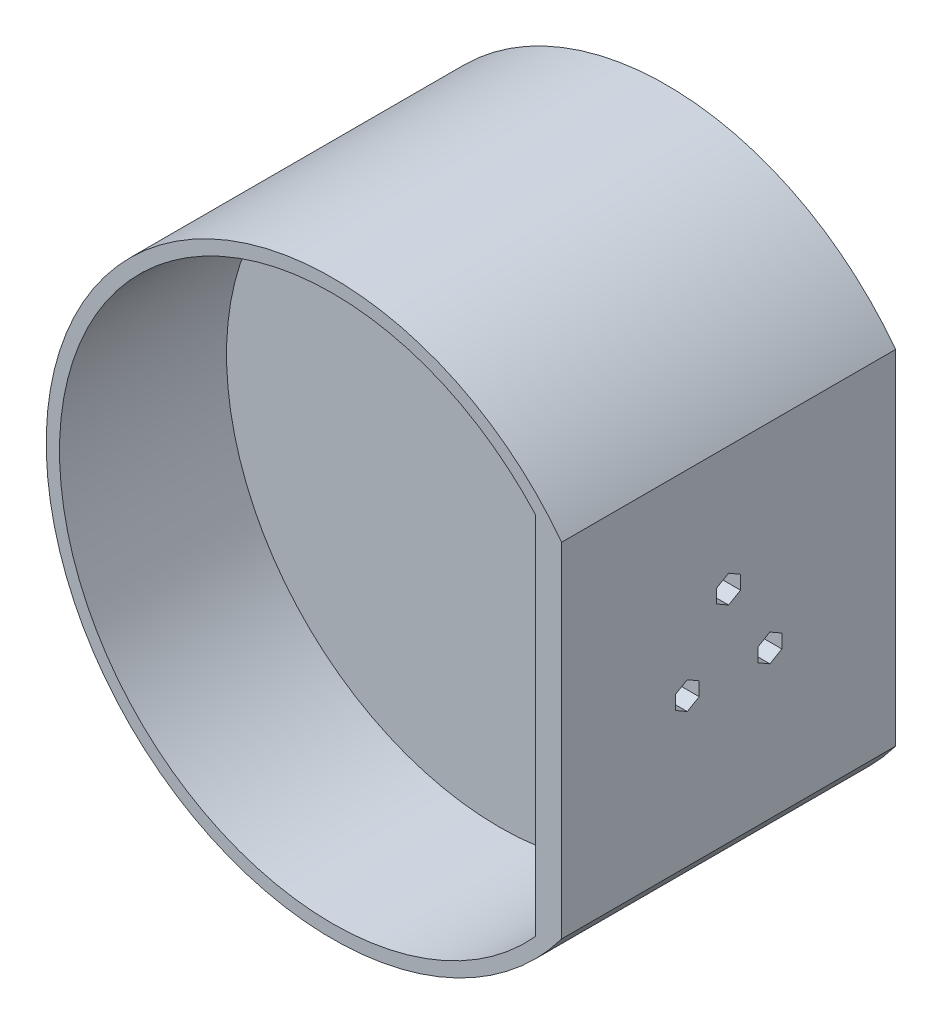
ISO-10303-21;
HEADER;
FILE_DESCRIPTION(('STEP AP214'),'2;1');
FILE_NAME('part.step','',(''),(''),'','','');
FILE_SCHEMA(('AUTOMOTIVE_DESIGN { 1 0 10303 214 1 1 1 1 }'));
ENDSEC;
DATA;
#1=APPLICATION_CONTEXT('core data for automotive mechanical design processes');
#2=APPLICATION_PROTOCOL_DEFINITION('international standard','automotive_design',2000,#1);
#3=PRODUCT_CONTEXT('',#1,'mechanical');
#4=PRODUCT('Part','Part','',(#3));
#5=PRODUCT_RELATED_PRODUCT_CATEGORY('part','',(#4));
#6=PRODUCT_DEFINITION_FORMATION('','',#4);
#7=PRODUCT_DEFINITION_CONTEXT('part definition',#1,'design');
#8=PRODUCT_DEFINITION('design','',#6,#7);
#9=PRODUCT_DEFINITION_SHAPE('','',#8);
#10=(LENGTH_UNIT() NAMED_UNIT(*) SI_UNIT(.MILLI.,.METRE.));
#11=(NAMED_UNIT(*) PLANE_ANGLE_UNIT() SI_UNIT($,.RADIAN.));
#12=(NAMED_UNIT(*) SI_UNIT($,.STERADIAN.) SOLID_ANGLE_UNIT());
#13=UNCERTAINTY_MEASURE_WITH_UNIT(LENGTH_MEASURE(1.E-05),#10,'distance_accuracy_value','');
#14=(GEOMETRIC_REPRESENTATION_CONTEXT(3) GLOBAL_UNCERTAINTY_ASSIGNED_CONTEXT((#13)) GLOBAL_UNIT_ASSIGNED_CONTEXT((#10,
#11,#12)) REPRESENTATION_CONTEXT('',''));
#15=CARTESIAN_POINT('',(0.,0.,0.));
#16=DIRECTION('',(0.,0.,1.));
#17=DIRECTION('',(1.,0.,0.));
#18=AXIS2_PLACEMENT_3D('',#15,#16,#17);
#19=CARTESIAN_POINT('',(0.,0.,70.));
#20=DIRECTION('',(0.,0.,-1.));
#21=DIRECTION('',(-1.,0.,0.));
#22=AXIS2_PLACEMENT_3D('',#19,#20,#21);
#23=CYLINDRICAL_SURFACE('',#22,60.);
#24=CARTESIAN_POINT('',(0.,0.,0.));
#25=DIRECTION('',(0.,0.,1.));
#26=DIRECTION('',(1.,0.,0.));
#27=AXIS2_PLACEMENT_3D('',#24,#25,#26);
#28=CIRCLE('',#27,60.);
#29=CARTESIAN_POINT('',(48.,36.,0.));
#30=VERTEX_POINT('',#29);
#31=CARTESIAN_POINT('',(48.,-36.,0.));
#32=VERTEX_POINT('',#31);
#33=EDGE_CURVE('E248',#30,#32,#28,.T.);
#34=ORIENTED_EDGE('',*,*,#33,.T.);
#35=DIRECTION('',(0.,0.,-1.));
#36=VECTOR('',#35,1.);
#37=CARTESIAN_POINT('',(48.,-36.,70.));
#38=LINE('',#37,#36);
#39=CARTESIAN_POINT('',(48.,-36.,70.));
#40=VERTEX_POINT('',#39);
#41=EDGE_CURVE('E11',#40,#32,#38,.T.);
#42=ORIENTED_EDGE('',*,*,#41,.F.);
#43=CARTESIAN_POINT('',(0.,0.,70.));
#44=DIRECTION('',(0.,0.,1.));
#45=DIRECTION('',(1.,0.,0.));
#46=AXIS2_PLACEMENT_3D('',#43,#44,#45);
#47=CIRCLE('',#46,60.);
#48=CARTESIAN_POINT('',(48.,36.,70.));
#49=VERTEX_POINT('',#48);
#50=EDGE_CURVE('E352',#49,#40,#47,.T.);
#51=ORIENTED_EDGE('',*,*,#50,.F.);
#52=DIRECTION('',(0.,0.,-1.));
#53=VECTOR('',#52,1.);
#54=CARTESIAN_POINT('',(48.,36.,70.));
#55=LINE('',#54,#53);
#56=EDGE_CURVE('E48',#49,#30,#55,.T.);
#57=ORIENTED_EDGE('',*,*,#56,.T.);
#58=EDGE_LOOP('',(#34,#42,#51,#57));
#59=FACE_BOUND('',#58,.T.);
#60=ADVANCED_FACE('F41',(#59),#23,.T.);
#61=CARTESIAN_POINT('',(48.,36.,70.));
#62=DIRECTION('',(-1.,0.,0.));
#63=DIRECTION('',(0.,0.,1.));
#64=AXIS2_PLACEMENT_3D('',#61,#62,#63);
#65=PLANE('',#64);
#66=DIRECTION('',(0.,0.5,-0.866025403784438));
#67=VECTOR('',#66,1.);
#68=CARTESIAN_POINT('',(48.,7.11324865405187,35.));
#69=LINE('',#68,#67);
#70=CARTESIAN_POINT('',(48.,7.11324865405188,35.));
#71=VERTEX_POINT('',#70);
#72=CARTESIAN_POINT('',(48.,8.55662432702594,32.5));
#73=VERTEX_POINT('',#72);
#74=EDGE_CURVE('E231',#71,#73,#69,.T.);
#75=ORIENTED_EDGE('',*,*,#74,.F.);
#76=DIRECTION('',(0.,-0.5,-0.866025403784439));
#77=VECTOR('',#76,1.);
#78=CARTESIAN_POINT('',(48.,8.55662432702594,37.5));
#79=LINE('',#78,#77);
#80=CARTESIAN_POINT('',(48.,8.55662432702594,37.5));
#81=VERTEX_POINT('',#80);
#82=EDGE_CURVE('E63',#81,#71,#79,.T.);
#83=ORIENTED_EDGE('',*,*,#82,.F.);
#84=DIRECTION('',(0.,-1.,0.));
#85=VECTOR('',#84,1.);
#86=CARTESIAN_POINT('',(48.,11.4433756729741,37.5));
#87=LINE('',#86,#85);
#88=CARTESIAN_POINT('',(48.,11.4433756729741,37.5));
#89=VERTEX_POINT('',#88);
#90=EDGE_CURVE('E214',#89,#81,#87,.T.);
#91=ORIENTED_EDGE('',*,*,#90,.F.);
#92=DIRECTION('',(0.,-0.500000000000001,0.866025403784438));
#93=VECTOR('',#92,1.);
#94=CARTESIAN_POINT('',(48.,12.8867513459481,35.));
#95=LINE('',#94,#93);
#96=CARTESIAN_POINT('',(48.,12.8867513459481,35.));
#97=VERTEX_POINT('',#96);
#98=EDGE_CURVE('E241',#97,#89,#95,.T.);
#99=ORIENTED_EDGE('',*,*,#98,.F.);
#100=DIRECTION('',(0.,0.499999999999999,0.866025403784439));
#101=VECTOR('',#100,1.);
#102=CARTESIAN_POINT('',(48.,11.4433756729741,32.5));
#103=LINE('',#102,#101);
#104=CARTESIAN_POINT('',(48.,11.4433756729741,32.5));
#105=VERTEX_POINT('',#104);
#106=EDGE_CURVE('E238',#105,#97,#103,.T.);
#107=ORIENTED_EDGE('',*,*,#106,.F.);
#108=DIRECTION('',(0.,1.,0.));
#109=VECTOR('',#108,1.);
#110=CARTESIAN_POINT('',(48.,8.55662432702594,32.5));
#111=LINE('',#110,#109);
#112=EDGE_CURVE('E235',#73,#105,#111,.T.);
#113=ORIENTED_EDGE('',*,*,#112,.F.);
#114=EDGE_LOOP('',(#75,#83,#91,#99,#107,#113));
#115=FACE_BOUND('',#114,.T.);
#116=DIRECTION('',(0.,-1.,0.));
#117=VECTOR('',#116,1.);
#118=CARTESIAN_POINT('',(48.,-3.5566243270258,28.8397459621553));
#119=LINE('',#118,#117);
#120=CARTESIAN_POINT('',(48.,-3.5566243270258,28.8397459621553));
#121=VERTEX_POINT('',#120);
#122=CARTESIAN_POINT('',(48.,-6.44337567297393,28.8397459621553));
#123=VERTEX_POINT('',#122);
#124=EDGE_CURVE('E286',#121,#123,#119,.T.);
#125=ORIENTED_EDGE('',*,*,#124,.F.);
#126=DIRECTION('',(0.,-0.499999999999996,0.866025403784441));
#127=VECTOR('',#126,1.);
#128=CARTESIAN_POINT('',(48.,-2.11324865405174,26.3397459621553));
#129=LINE('',#128,#127);
#130=CARTESIAN_POINT('',(48.,-2.11324865405174,26.3397459621553));
#131=VERTEX_POINT('',#130);
#132=EDGE_CURVE('E232',#131,#121,#129,.T.);
#133=ORIENTED_EDGE('',*,*,#132,.F.);
#134=DIRECTION('',(0.,0.500000000000004,0.866025403784436));
#135=VECTOR('',#134,1.);
#136=CARTESIAN_POINT('',(48.,-3.55662432702582,23.8397459621553));
#137=LINE('',#136,#135);
#138=CARTESIAN_POINT('',(48.,-3.55662432702582,23.8397459621553));
#139=VERTEX_POINT('',#138);
#140=EDGE_CURVE('E273',#139,#131,#137,.T.);
#141=ORIENTED_EDGE('',*,*,#140,.F.);
#142=DIRECTION('',(0.,1.,0.));
#143=VECTOR('',#142,1.);
#144=CARTESIAN_POINT('',(48.,-6.44337567297394,23.8397459621554));
#145=LINE('',#144,#143);
#146=CARTESIAN_POINT('',(48.,-6.44337567297394,23.8397459621554));
#147=VERTEX_POINT('',#146);
#148=EDGE_CURVE('E276',#147,#139,#145,.T.);
#149=ORIENTED_EDGE('',*,*,#148,.F.);
#150=DIRECTION('',(0.,0.499999999999996,-0.866025403784441));
#151=VECTOR('',#150,1.);
#152=CARTESIAN_POINT('',(48.,-7.886751345948,26.3397459621554));
#153=LINE('',#152,#151);
#154=CARTESIAN_POINT('',(48.,-7.886751345948,26.3397459621554));
#155=VERTEX_POINT('',#154);
#156=EDGE_CURVE('E280',#155,#147,#153,.T.);
#157=ORIENTED_EDGE('',*,*,#156,.F.);
#158=DIRECTION('',(0.,-0.500000000000004,-0.866025403784436));
#159=VECTOR('',#158,1.);
#160=CARTESIAN_POINT('',(48.,-6.44337567297393,28.8397459621553));
#161=LINE('',#160,#159);
#162=EDGE_CURVE('E283',#123,#155,#161,.T.);
#163=ORIENTED_EDGE('',*,*,#162,.F.);
#164=EDGE_LOOP('',(#125,#133,#141,#149,#157,#163));
#165=FACE_BOUND('',#164,.T.);
#166=DIRECTION('',(0.,0.500000000000008,0.866025403784434));
#167=VECTOR('',#166,1.);
#168=CARTESIAN_POINT('',(48.,-3.55662432702605,41.1602540378441));
#169=LINE('',#168,#167);
#170=CARTESIAN_POINT('',(48.,-3.55662432702605,41.1602540378441));
#171=VERTEX_POINT('',#170);
#172=CARTESIAN_POINT('',(48.,-2.11324865405196,43.6602540378441));
#173=VERTEX_POINT('',#172);
#174=EDGE_CURVE('E332',#171,#173,#169,.T.);
#175=ORIENTED_EDGE('',*,*,#174,.F.);
#176=DIRECTION('',(0.,1.,0.));
#177=VECTOR('',#176,1.);
#178=CARTESIAN_POINT('',(48.,-6.44337567297417,41.1602540378442));
#179=LINE('',#178,#177);
#180=CARTESIAN_POINT('',(48.,-6.44337567297417,41.1602540378442));
#181=VERTEX_POINT('',#180);
#182=EDGE_CURVE('E272',#181,#171,#179,.T.);
#183=ORIENTED_EDGE('',*,*,#182,.F.);
#184=DIRECTION('',(0.,0.499999999999993,-0.866025403784443));
#185=VECTOR('',#184,1.);
#186=CARTESIAN_POINT('',(48.,-7.88675134594821,43.6602540378442));
#187=LINE('',#186,#185);
#188=CARTESIAN_POINT('',(48.,-7.88675134594821,43.6602540378442));
#189=VERTEX_POINT('',#188);
#190=EDGE_CURVE('E319',#189,#181,#187,.T.);
#191=ORIENTED_EDGE('',*,*,#190,.F.);
#192=DIRECTION('',(0.,-0.500000000000008,-0.866025403784434));
#193=VECTOR('',#192,1.);
#194=CARTESIAN_POINT('',(48.,-6.44337567297413,46.1602540378442));
#195=LINE('',#194,#193);
#196=CARTESIAN_POINT('',(48.,-6.44337567297413,46.1602540378442));
#197=VERTEX_POINT('',#196);
#198=EDGE_CURVE('E322',#197,#189,#195,.T.);
#199=ORIENTED_EDGE('',*,*,#198,.F.);
#200=DIRECTION('',(0.,-1.,0.));
#201=VECTOR('',#200,1.);
#202=CARTESIAN_POINT('',(48.,-3.556624327026,46.1602540378441));
#203=LINE('',#202,#201);
#204=CARTESIAN_POINT('',(48.,-3.556624327026,46.1602540378441));
#205=VERTEX_POINT('',#204);
#206=EDGE_CURVE('E326',#205,#197,#203,.T.);
#207=ORIENTED_EDGE('',*,*,#206,.F.);
#208=DIRECTION('',(0.,-0.499999999999992,0.866025403784443));
#209=VECTOR('',#208,1.);
#210=CARTESIAN_POINT('',(48.,-2.11324865405196,43.6602540378441));
#211=LINE('',#210,#209);
#212=EDGE_CURVE('E329',#173,#205,#211,.T.);
#213=ORIENTED_EDGE('',*,*,#212,.F.);
#214=EDGE_LOOP('',(#175,#183,#191,#199,#207,#213));
#215=FACE_BOUND('',#214,.T.);
#216=DIRECTION('',(0.,1.,0.));
#217=VECTOR('',#216,1.);
#218=CARTESIAN_POINT('',(48.,36.,0.));
#219=LINE('',#218,#217);
#220=EDGE_CURVE('E356',#32,#30,#219,.T.);
#221=ORIENTED_EDGE('',*,*,#220,.T.);
#222=ORIENTED_EDGE('',*,*,#56,.F.);
#223=DIRECTION('',(0.,1.,0.));
#224=VECTOR('',#223,1.);
#225=CARTESIAN_POINT('',(48.,36.,70.));
#226=LINE('',#225,#224);
#227=EDGE_CURVE('E355',#40,#49,#226,.T.);
#228=ORIENTED_EDGE('',*,*,#227,.F.);
#229=ORIENTED_EDGE('',*,*,#41,.T.);
#230=EDGE_LOOP('',(#221,#222,#228,#229));
#231=FACE_BOUND('',#230,.T.);
#232=ADVANCED_FACE('F369',(#115,#165,#215,#231),#65,.F.);
#233=CARTESIAN_POINT('',(0.,0.,70.));
#234=DIRECTION('',(0.,0.,1.));
#235=DIRECTION('',(1.,0.,0.));
#236=AXIS2_PLACEMENT_3D('',#233,#234,#235);
#237=PLANE('',#236);
#238=CARTESIAN_POINT('',(0.,0.,70.));
#239=DIRECTION('',(0.,0.,1.));
#240=DIRECTION('',(1.,0.,0.));
#241=AXIS2_PLACEMENT_3D('',#238,#239,#240);
#242=CIRCLE('',#241,57.2145243919241);
#243=CARTESIAN_POINT('',(42.4984665001289,38.3064243506425,70.));
#244=VERTEX_POINT('',#243);
#245=CARTESIAN_POINT('',(42.4984665001289,-38.3064243506425,70.));
#246=VERTEX_POINT('',#245);
#247=EDGE_CURVE('E55',#244,#246,#242,.T.);
#248=ORIENTED_EDGE('',*,*,#247,.F.);
#249=DIRECTION('',(0.,1.,0.));
#250=VECTOR('',#249,1.);
#251=CARTESIAN_POINT('',(42.4984665001289,38.3064243506425,70.));
#252=LINE('',#251,#250);
#253=EDGE_CURVE('E201',#246,#244,#252,.T.);
#254=ORIENTED_EDGE('',*,*,#253,.F.);
#255=EDGE_LOOP('',(#248,#254));
#256=FACE_BOUND('',#255,.T.);
#257=ORIENTED_EDGE('',*,*,#50,.T.);
#258=ORIENTED_EDGE('',*,*,#227,.T.);
#259=EDGE_LOOP('',(#257,#258));
#260=FACE_BOUND('',#259,.T.);
#261=ADVANCED_FACE('F371',(#256,#260),#237,.T.);
#262=CARTESIAN_POINT('',(0.,0.,0.));
#263=DIRECTION('',(0.,0.,1.));
#264=DIRECTION('',(1.,0.,0.));
#265=AXIS2_PLACEMENT_3D('',#262,#263,#264);
#266=PLANE('',#265);
#267=ORIENTED_EDGE('',*,*,#33,.F.);
#268=ORIENTED_EDGE('',*,*,#220,.F.);
#269=EDGE_LOOP('',(#267,#268));
#270=FACE_BOUND('',#269,.T.);
#271=ADVANCED_FACE('F368',(#270),#266,.F.);
#272=CARTESIAN_POINT('',(43.,-6.44337567297417,41.1602540378442));
#273=DIRECTION('',(0.,0.,-1.));
#274=DIRECTION('',(0.,1.,0.));
#275=AXIS2_PLACEMENT_3D('',#272,#273,#274);
#276=PLANE('',#275);
#277=ORIENTED_EDGE('',*,*,#182,.T.);
#278=DIRECTION('',(1.,0.,0.));
#279=VECTOR('',#278,1.);
#280=CARTESIAN_POINT('',(43.,-3.55662432702605,41.1602540378441));
#281=LINE('',#280,#279);
#282=CARTESIAN_POINT('',(43.,-3.55662432702605,41.1602540378441));
#283=VERTEX_POINT('',#282);
#284=EDGE_CURVE('E306',#283,#171,#281,.T.);
#285=ORIENTED_EDGE('',*,*,#284,.F.);
#286=DIRECTION('',(0.,1.,0.));
#287=VECTOR('',#286,1.);
#288=CARTESIAN_POINT('',(43.,-6.44337567297417,41.1602540378442));
#289=LINE('',#288,#287);
#290=CARTESIAN_POINT('',(43.,-6.44337567297417,41.1602540378442));
#291=VERTEX_POINT('',#290);
#292=EDGE_CURVE('E323',#291,#283,#289,.T.);
#293=ORIENTED_EDGE('',*,*,#292,.F.);
#294=DIRECTION('',(1.,0.,0.));
#295=VECTOR('',#294,1.);
#296=CARTESIAN_POINT('',(43.,-6.44337567297417,41.1602540378442));
#297=LINE('',#296,#295);
#298=EDGE_CURVE('E208',#291,#181,#297,.T.);
#299=ORIENTED_EDGE('',*,*,#298,.T.);
#300=EDGE_LOOP('',(#277,#285,#293,#299));
#301=FACE_BOUND('',#300,.T.);
#302=ADVANCED_FACE('F380',(#301),#276,.F.);
#303=CARTESIAN_POINT('',(43.,-7.88675134594821,43.6602540378442));
#304=DIRECTION('',(0.,-0.866025403784443,-0.499999999999993));
#305=DIRECTION('',(0.,0.499999999999993,-0.866025403784443));
#306=AXIS2_PLACEMENT_3D('',#303,#304,#305);
#307=PLANE('',#306);
#308=ORIENTED_EDGE('',*,*,#190,.T.);
#309=ORIENTED_EDGE('',*,*,#298,.F.);
#310=DIRECTION('',(0.,0.499999999999993,-0.866025403784443));
#311=VECTOR('',#310,1.);
#312=CARTESIAN_POINT('',(43.,-7.88675134594821,43.6602540378442));
#313=LINE('',#312,#311);
#314=CARTESIAN_POINT('',(43.,-7.88675134594821,43.6602540378442));
#315=VERTEX_POINT('',#314);
#316=EDGE_CURVE('E309',#315,#291,#313,.T.);
#317=ORIENTED_EDGE('',*,*,#316,.F.);
#318=DIRECTION('',(1.,0.,0.));
#319=VECTOR('',#318,1.);
#320=CARTESIAN_POINT('',(43.,-7.88675134594821,43.6602540378442));
#321=LINE('',#320,#319);
#322=EDGE_CURVE('E316',#315,#189,#321,.T.);
#323=ORIENTED_EDGE('',*,*,#322,.T.);
#324=EDGE_LOOP('',(#308,#309,#317,#323));
#325=FACE_BOUND('',#324,.T.);
#326=ADVANCED_FACE('F405',(#325),#307,.F.);
#327=CARTESIAN_POINT('',(43.,-6.44337567297413,46.1602540378442));
#328=DIRECTION('',(0.,-0.866025403784434,0.500000000000008));
#329=DIRECTION('',(0.,-0.500000000000008,-0.866025403784434));
#330=AXIS2_PLACEMENT_3D('',#327,#328,#329);
#331=PLANE('',#330);
#332=ORIENTED_EDGE('',*,*,#198,.T.);
#333=ORIENTED_EDGE('',*,*,#322,.F.);
#334=DIRECTION('',(0.,-0.500000000000008,-0.866025403784434));
#335=VECTOR('',#334,1.);
#336=CARTESIAN_POINT('',(43.,-6.44337567297413,46.1602540378442));
#337=LINE('',#336,#335);
#338=CARTESIAN_POINT('',(43.,-6.44337567297413,46.1602540378442));
#339=VERTEX_POINT('',#338);
#340=EDGE_CURVE('E338',#339,#315,#337,.T.);
#341=ORIENTED_EDGE('',*,*,#340,.F.);
#342=DIRECTION('',(1.,0.,0.));
#343=VECTOR('',#342,1.);
#344=CARTESIAN_POINT('',(43.,-6.44337567297413,46.1602540378442));
#345=LINE('',#344,#343);
#346=EDGE_CURVE('E314',#339,#197,#345,.T.);
#347=ORIENTED_EDGE('',*,*,#346,.T.);
#348=EDGE_LOOP('',(#332,#333,#341,#347));
#349=FACE_BOUND('',#348,.T.);
#350=ADVANCED_FACE('F414',(#349),#331,.F.);
#351=CARTESIAN_POINT('',(43.,-3.556624327026,46.1602540378441));
#352=DIRECTION('',(0.,0.,1.));
#353=DIRECTION('',(0.,-1.,0.));
#354=AXIS2_PLACEMENT_3D('',#351,#352,#353);
#355=PLANE('',#354);
#356=ORIENTED_EDGE('',*,*,#206,.T.);
#357=ORIENTED_EDGE('',*,*,#346,.F.);
#358=DIRECTION('',(0.,-1.,0.));
#359=VECTOR('',#358,1.);
#360=CARTESIAN_POINT('',(43.,-3.556624327026,46.1602540378441));
#361=LINE('',#360,#359);
#362=CARTESIAN_POINT('',(43.,-3.556624327026,46.1602540378441));
#363=VERTEX_POINT('',#362);
#364=EDGE_CURVE('E341',#363,#339,#361,.T.);
#365=ORIENTED_EDGE('',*,*,#364,.F.);
#366=DIRECTION('',(1.,0.,0.));
#367=VECTOR('',#366,1.);
#368=CARTESIAN_POINT('',(43.,-3.556624327026,46.1602540378441));
#369=LINE('',#368,#367);
#370=EDGE_CURVE('E312',#363,#205,#369,.T.);
#371=ORIENTED_EDGE('',*,*,#370,.T.);
#372=EDGE_LOOP('',(#356,#357,#365,#371));
#373=FACE_BOUND('',#372,.T.);
#374=ADVANCED_FACE('F423',(#373),#355,.F.);
#375=CARTESIAN_POINT('',(43.,-2.11324865405196,43.6602540378441));
#376=DIRECTION('',(0.,0.866025403784443,0.499999999999992));
#377=DIRECTION('',(0.,-0.499999999999992,0.866025403784443));
#378=AXIS2_PLACEMENT_3D('',#375,#376,#377);
#379=PLANE('',#378);
#380=ORIENTED_EDGE('',*,*,#212,.T.);
#381=ORIENTED_EDGE('',*,*,#370,.F.);
#382=DIRECTION('',(0.,-0.499999999999992,0.866025403784443));
#383=VECTOR('',#382,1.);
#384=CARTESIAN_POINT('',(43.,-2.11324865405196,43.6602540378441));
#385=LINE('',#384,#383);
#386=CARTESIAN_POINT('',(43.,-2.11324865405196,43.6602540378441));
#387=VERTEX_POINT('',#386);
#388=EDGE_CURVE('E344',#387,#363,#385,.T.);
#389=ORIENTED_EDGE('',*,*,#388,.F.);
#390=DIRECTION('',(1.,0.,0.));
#391=VECTOR('',#390,1.);
#392=CARTESIAN_POINT('',(43.,-2.11324865405196,43.6602540378441));
#393=LINE('',#392,#391);
#394=EDGE_CURVE('E310',#387,#173,#393,.T.);
#395=ORIENTED_EDGE('',*,*,#394,.T.);
#396=EDGE_LOOP('',(#380,#381,#389,#395));
#397=FACE_BOUND('',#396,.T.);
#398=ADVANCED_FACE('F432',(#397),#379,.F.);
#399=CARTESIAN_POINT('',(43.,-3.55662432702605,41.1602540378441));
#400=DIRECTION('',(0.,0.866025403784434,-0.500000000000008));
#401=DIRECTION('',(0.,0.500000000000008,0.866025403784434));
#402=AXIS2_PLACEMENT_3D('',#399,#400,#401);
#403=PLANE('',#402);
#404=ORIENTED_EDGE('',*,*,#174,.T.);
#405=ORIENTED_EDGE('',*,*,#394,.F.);
#406=DIRECTION('',(0.,0.500000000000008,0.866025403784434));
#407=VECTOR('',#406,1.);
#408=CARTESIAN_POINT('',(43.,-3.55662432702605,41.1602540378441));
#409=LINE('',#408,#407);
#410=EDGE_CURVE('E347',#283,#387,#409,.T.);
#411=ORIENTED_EDGE('',*,*,#410,.F.);
#412=ORIENTED_EDGE('',*,*,#284,.T.);
#413=EDGE_LOOP('',(#404,#405,#411,#412));
#414=FACE_BOUND('',#413,.T.);
#415=ADVANCED_FACE('F441',(#414),#403,.F.);
#416=CARTESIAN_POINT('',(43.,0.,0.));
#417=DIRECTION('',(1.,0.,0.));
#418=DIRECTION('',(0.,0.,-1.));
#419=AXIS2_PLACEMENT_3D('',#416,#417,#418);
#420=PLANE('',#419);
#421=ORIENTED_EDGE('',*,*,#292,.T.);
#422=ORIENTED_EDGE('',*,*,#410,.T.);
#423=ORIENTED_EDGE('',*,*,#388,.T.);
#424=ORIENTED_EDGE('',*,*,#364,.T.);
#425=ORIENTED_EDGE('',*,*,#340,.T.);
#426=ORIENTED_EDGE('',*,*,#316,.T.);
#427=EDGE_LOOP('',(#421,#422,#423,#424,#425,#426));
#428=FACE_BOUND('',#427,.T.);
#429=ADVANCED_FACE('F450',(#428),#420,.T.);
#430=CARTESIAN_POINT('',(43.,-2.11324865405174,26.3397459621553));
#431=DIRECTION('',(0.,0.866025403784441,0.499999999999996));
#432=DIRECTION('',(0.,-0.499999999999996,0.866025403784441));
#433=AXIS2_PLACEMENT_3D('',#430,#431,#432);
#434=PLANE('',#433);
#435=ORIENTED_EDGE('',*,*,#132,.T.);
#436=DIRECTION('',(1.,0.,0.));
#437=VECTOR('',#436,1.);
#438=CARTESIAN_POINT('',(43.,-3.5566243270258,28.8397459621553));
#439=LINE('',#438,#437);
#440=CARTESIAN_POINT('',(43.,-3.5566243270258,28.8397459621553));
#441=VERTEX_POINT('',#440);
#442=EDGE_CURVE('E258',#441,#121,#439,.T.);
#443=ORIENTED_EDGE('',*,*,#442,.F.);
#444=DIRECTION('',(0.,-0.499999999999996,0.866025403784441));
#445=VECTOR('',#444,1.);
#446=CARTESIAN_POINT('',(43.,-2.11324865405174,26.3397459621553));
#447=LINE('',#446,#445);
#448=CARTESIAN_POINT('',(43.,-2.11324865405174,26.3397459621553));
#449=VERTEX_POINT('',#448);
#450=EDGE_CURVE('E277',#449,#441,#447,.T.);
#451=ORIENTED_EDGE('',*,*,#450,.F.);
#452=DIRECTION('',(1.,0.,0.));
#453=VECTOR('',#452,1.);
#454=CARTESIAN_POINT('',(43.,-2.11324865405174,26.3397459621553));
#455=LINE('',#454,#453);
#456=EDGE_CURVE('E270',#449,#131,#455,.T.);
#457=ORIENTED_EDGE('',*,*,#456,.T.);
#458=EDGE_LOOP('',(#435,#443,#451,#457));
#459=FACE_BOUND('',#458,.T.);
#460=ADVANCED_FACE('F459',(#459),#434,.F.);
#461=CARTESIAN_POINT('',(43.,-3.55662432702582,23.8397459621553));
#462=DIRECTION('',(0.,0.866025403784436,-0.500000000000004));
#463=DIRECTION('',(0.,0.500000000000004,0.866025403784436));
#464=AXIS2_PLACEMENT_3D('',#461,#462,#463);
#465=PLANE('',#464);
#466=ORIENTED_EDGE('',*,*,#140,.T.);
#467=ORIENTED_EDGE('',*,*,#456,.F.);
#468=DIRECTION('',(0.,0.500000000000004,0.866025403784436));
#469=VECTOR('',#468,1.);
#470=CARTESIAN_POINT('',(43.,-3.55662432702582,23.8397459621553));
#471=LINE('',#470,#469);
#472=CARTESIAN_POINT('',(43.,-3.55662432702582,23.8397459621553));
#473=VERTEX_POINT('',#472);
#474=EDGE_CURVE('E261',#473,#449,#471,.T.);
#475=ORIENTED_EDGE('',*,*,#474,.F.);
#476=DIRECTION('',(1.,0.,0.));
#477=VECTOR('',#476,1.);
#478=CARTESIAN_POINT('',(43.,-3.55662432702582,23.8397459621553));
#479=LINE('',#478,#477);
#480=EDGE_CURVE('E268',#473,#139,#479,.T.);
#481=ORIENTED_EDGE('',*,*,#480,.T.);
#482=EDGE_LOOP('',(#466,#467,#475,#481));
#483=FACE_BOUND('',#482,.T.);
#484=ADVANCED_FACE('F467',(#483),#465,.F.);
#485=CARTESIAN_POINT('',(43.,-6.44337567297394,23.8397459621554));
#486=DIRECTION('',(0.,0.,-1.));
#487=DIRECTION('',(0.,1.,0.));
#488=AXIS2_PLACEMENT_3D('',#485,#486,#487);
#489=PLANE('',#488);
#490=ORIENTED_EDGE('',*,*,#148,.T.);
#491=ORIENTED_EDGE('',*,*,#480,.F.);
#492=DIRECTION('',(0.,1.,0.));
#493=VECTOR('',#492,1.);
#494=CARTESIAN_POINT('',(43.,-6.44337567297394,23.8397459621554));
#495=LINE('',#494,#493);
#496=CARTESIAN_POINT('',(43.,-6.44337567297394,23.8397459621554));
#497=VERTEX_POINT('',#496);
#498=EDGE_CURVE('E292',#497,#473,#495,.T.);
#499=ORIENTED_EDGE('',*,*,#498,.F.);
#500=DIRECTION('',(1.,0.,0.));
#501=VECTOR('',#500,1.);
#502=CARTESIAN_POINT('',(43.,-6.44337567297394,23.8397459621554));
#503=LINE('',#502,#501);
#504=EDGE_CURVE('E266',#497,#147,#503,.T.);
#505=ORIENTED_EDGE('',*,*,#504,.T.);
#506=EDGE_LOOP('',(#490,#491,#499,#505));
#507=FACE_BOUND('',#506,.T.);
#508=ADVANCED_FACE('F476',(#507),#489,.F.);
#509=CARTESIAN_POINT('',(43.,-7.886751345948,26.3397459621554));
#510=DIRECTION('',(0.,-0.866025403784441,-0.499999999999996));
#511=DIRECTION('',(0.,0.499999999999996,-0.866025403784441));
#512=AXIS2_PLACEMENT_3D('',#509,#510,#511);
#513=PLANE('',#512);
#514=ORIENTED_EDGE('',*,*,#156,.T.);
#515=ORIENTED_EDGE('',*,*,#504,.F.);
#516=DIRECTION('',(0.,0.499999999999996,-0.866025403784441));
#517=VECTOR('',#516,1.);
#518=CARTESIAN_POINT('',(43.,-7.886751345948,26.3397459621554));
#519=LINE('',#518,#517);
#520=CARTESIAN_POINT('',(43.,-7.886751345948,26.3397459621554));
#521=VERTEX_POINT('',#520);
#522=EDGE_CURVE('E295',#521,#497,#519,.T.);
#523=ORIENTED_EDGE('',*,*,#522,.F.);
#524=DIRECTION('',(1.,0.,0.));
#525=VECTOR('',#524,1.);
#526=CARTESIAN_POINT('',(43.,-7.886751345948,26.3397459621554));
#527=LINE('',#526,#525);
#528=EDGE_CURVE('E264',#521,#155,#527,.T.);
#529=ORIENTED_EDGE('',*,*,#528,.T.);
#530=EDGE_LOOP('',(#514,#515,#523,#529));
#531=FACE_BOUND('',#530,.T.);
#532=ADVANCED_FACE('F485',(#531),#513,.F.);
#533=CARTESIAN_POINT('',(43.,-6.44337567297393,28.8397459621553));
#534=DIRECTION('',(0.,-0.866025403784436,0.500000000000004));
#535=DIRECTION('',(0.,-0.500000000000004,-0.866025403784436));
#536=AXIS2_PLACEMENT_3D('',#533,#534,#535);
#537=PLANE('',#536);
#538=ORIENTED_EDGE('',*,*,#162,.T.);
#539=ORIENTED_EDGE('',*,*,#528,.F.);
#540=DIRECTION('',(0.,-0.500000000000004,-0.866025403784436));
#541=VECTOR('',#540,1.);
#542=CARTESIAN_POINT('',(43.,-6.44337567297393,28.8397459621553));
#543=LINE('',#542,#541);
#544=CARTESIAN_POINT('',(43.,-6.44337567297393,28.8397459621553));
#545=VERTEX_POINT('',#544);
#546=EDGE_CURVE('E298',#545,#521,#543,.T.);
#547=ORIENTED_EDGE('',*,*,#546,.F.);
#548=DIRECTION('',(1.,0.,0.));
#549=VECTOR('',#548,1.);
#550=CARTESIAN_POINT('',(43.,-6.44337567297393,28.8397459621553));
#551=LINE('',#550,#549);
#552=EDGE_CURVE('E262',#545,#123,#551,.T.);
#553=ORIENTED_EDGE('',*,*,#552,.T.);
#554=EDGE_LOOP('',(#538,#539,#547,#553));
#555=FACE_BOUND('',#554,.T.);
#556=ADVANCED_FACE('F494',(#555),#537,.F.);
#557=CARTESIAN_POINT('',(43.,-3.5566243270258,28.8397459621553));
#558=DIRECTION('',(0.,0.,1.));
#559=DIRECTION('',(0.,-1.,0.));
#560=AXIS2_PLACEMENT_3D('',#557,#558,#559);
#561=PLANE('',#560);
#562=ORIENTED_EDGE('',*,*,#124,.T.);
#563=ORIENTED_EDGE('',*,*,#552,.F.);
#564=DIRECTION('',(0.,-1.,0.));
#565=VECTOR('',#564,1.);
#566=CARTESIAN_POINT('',(43.,-3.5566243270258,28.8397459621553));
#567=LINE('',#566,#565);
#568=EDGE_CURVE('E301',#441,#545,#567,.T.);
#569=ORIENTED_EDGE('',*,*,#568,.F.);
#570=ORIENTED_EDGE('',*,*,#442,.T.);
#571=EDGE_LOOP('',(#562,#563,#569,#570));
#572=FACE_BOUND('',#571,.T.);
#573=ADVANCED_FACE('F503',(#572),#561,.F.);
#574=CARTESIAN_POINT('',(43.,0.,0.));
#575=DIRECTION('',(1.,0.,0.));
#576=DIRECTION('',(0.,0.,-1.));
#577=AXIS2_PLACEMENT_3D('',#574,#575,#576);
#578=PLANE('',#577);
#579=ORIENTED_EDGE('',*,*,#450,.T.);
#580=ORIENTED_EDGE('',*,*,#568,.T.);
#581=ORIENTED_EDGE('',*,*,#546,.T.);
#582=ORIENTED_EDGE('',*,*,#522,.T.);
#583=ORIENTED_EDGE('',*,*,#498,.T.);
#584=ORIENTED_EDGE('',*,*,#474,.T.);
#585=EDGE_LOOP('',(#579,#580,#581,#582,#583,#584));
#586=FACE_BOUND('',#585,.T.);
#587=ADVANCED_FACE('F512',(#586),#578,.T.);
#588=CARTESIAN_POINT('',(43.,8.55662432702594,37.5));
#589=DIRECTION('',(0.,-0.866025403784439,0.5));
#590=DIRECTION('',(0.,-0.5,-0.866025403784439));
#591=AXIS2_PLACEMENT_3D('',#588,#589,#590);
#592=PLANE('',#591);
#593=ORIENTED_EDGE('',*,*,#82,.T.);
#594=DIRECTION('',(1.,0.,0.));
#595=VECTOR('',#594,1.);
#596=CARTESIAN_POINT('',(43.,7.11324865405187,35.));
#597=LINE('',#596,#595);
#598=CARTESIAN_POINT('',(43.,7.11324865405187,35.));
#599=VERTEX_POINT('',#598);
#600=EDGE_CURVE('E229',#599,#71,#597,.T.);
#601=ORIENTED_EDGE('',*,*,#600,.F.);
#602=DIRECTION('',(0.,-0.5,-0.866025403784439));
#603=VECTOR('',#602,1.);
#604=CARTESIAN_POINT('',(43.,8.55662432702594,37.5));
#605=LINE('',#604,#603);
#606=CARTESIAN_POINT('',(43.,8.55662432702594,37.5));
#607=VERTEX_POINT('',#606);
#608=EDGE_CURVE('E210',#607,#599,#605,.T.);
#609=ORIENTED_EDGE('',*,*,#608,.F.);
#610=DIRECTION('',(1.,0.,0.));
#611=VECTOR('',#610,1.);
#612=CARTESIAN_POINT('',(43.,8.55662432702594,37.5));
#613=LINE('',#612,#611);
#614=EDGE_CURVE('E246',#607,#81,#613,.T.);
#615=ORIENTED_EDGE('',*,*,#614,.T.);
#616=EDGE_LOOP('',(#593,#601,#609,#615));
#617=FACE_BOUND('',#616,.T.);
#618=ADVANCED_FACE('F521',(#617),#592,.F.);
#619=CARTESIAN_POINT('',(43.,11.4433756729741,37.5));
#620=DIRECTION('',(0.,0.,1.));
#621=DIRECTION('',(1.,0.,0.));
#622=AXIS2_PLACEMENT_3D('',#619,#620,#621);
#623=PLANE('',#622);
#624=ORIENTED_EDGE('',*,*,#90,.T.);
#625=ORIENTED_EDGE('',*,*,#614,.F.);
#626=DIRECTION('',(0.,-1.,0.));
#627=VECTOR('',#626,1.);
#628=CARTESIAN_POINT('',(43.,11.4433756729741,37.5));
#629=LINE('',#628,#627);
#630=CARTESIAN_POINT('',(43.,11.4433756729741,37.5));
#631=VERTEX_POINT('',#630);
#632=EDGE_CURVE('E226',#631,#607,#629,.T.);
#633=ORIENTED_EDGE('',*,*,#632,.F.);
#634=DIRECTION('',(1.,0.,0.));
#635=VECTOR('',#634,1.);
#636=CARTESIAN_POINT('',(43.,11.4433756729741,37.5));
#637=LINE('',#636,#635);
#638=EDGE_CURVE('E249',#631,#89,#637,.T.);
#639=ORIENTED_EDGE('',*,*,#638,.T.);
#640=EDGE_LOOP('',(#624,#625,#633,#639));
#641=FACE_BOUND('',#640,.T.);
#642=ADVANCED_FACE('F530',(#641),#623,.F.);
#643=CARTESIAN_POINT('',(43.,12.8867513459481,35.));
#644=DIRECTION('',(0.,0.866025403784438,0.500000000000001));
#645=DIRECTION('',(0.,-0.500000000000001,0.866025403784438));
#646=AXIS2_PLACEMENT_3D('',#643,#644,#645);
#647=PLANE('',#646);
#648=ORIENTED_EDGE('',*,*,#98,.T.);
#649=ORIENTED_EDGE('',*,*,#638,.F.);
#650=DIRECTION('',(0.,-0.500000000000001,0.866025403784438));
#651=VECTOR('',#650,1.);
#652=CARTESIAN_POINT('',(43.,12.8867513459481,35.));
#653=LINE('',#652,#651);
#654=CARTESIAN_POINT('',(43.,12.8867513459481,35.));
#655=VERTEX_POINT('',#654);
#656=EDGE_CURVE('E223',#655,#631,#653,.T.);
#657=ORIENTED_EDGE('',*,*,#656,.F.);
#658=DIRECTION('',(1.,0.,0.));
#659=VECTOR('',#658,1.);
#660=CARTESIAN_POINT('',(43.,12.8867513459481,35.));
#661=LINE('',#660,#659);
#662=EDGE_CURVE('E251',#655,#97,#661,.T.);
#663=ORIENTED_EDGE('',*,*,#662,.T.);
#664=EDGE_LOOP('',(#648,#649,#657,#663));
#665=FACE_BOUND('',#664,.T.);
#666=ADVANCED_FACE('F538',(#665),#647,.F.);
#667=CARTESIAN_POINT('',(43.,11.4433756729741,32.5));
#668=DIRECTION('',(0.,0.866025403784439,-0.5));
#669=DIRECTION('',(0.,0.5,0.866025403784439));
#670=AXIS2_PLACEMENT_3D('',#667,#668,#669);
#671=PLANE('',#670);
#672=ORIENTED_EDGE('',*,*,#106,.T.);
#673=ORIENTED_EDGE('',*,*,#662,.F.);
#674=DIRECTION('',(0.,0.499999999999999,0.866025403784439));
#675=VECTOR('',#674,1.);
#676=CARTESIAN_POINT('',(43.,11.4433756729741,32.5));
#677=LINE('',#676,#675);
#678=CARTESIAN_POINT('',(43.,11.4433756729741,32.5));
#679=VERTEX_POINT('',#678);
#680=EDGE_CURVE('E220',#679,#655,#677,.T.);
#681=ORIENTED_EDGE('',*,*,#680,.F.);
#682=DIRECTION('',(1.,0.,0.));
#683=VECTOR('',#682,1.);
#684=CARTESIAN_POINT('',(43.,11.4433756729741,32.5));
#685=LINE('',#684,#683);
#686=EDGE_CURVE('E253',#679,#105,#685,.T.);
#687=ORIENTED_EDGE('',*,*,#686,.T.);
#688=EDGE_LOOP('',(#672,#673,#681,#687));
#689=FACE_BOUND('',#688,.T.);
#690=ADVANCED_FACE('F547',(#689),#671,.F.);
#691=CARTESIAN_POINT('',(43.,8.55662432702594,32.5));
#692=DIRECTION('',(0.,0.,-1.));
#693=DIRECTION('',(-1.,0.,0.));
#694=AXIS2_PLACEMENT_3D('',#691,#692,#693);
#695=PLANE('',#694);
#696=ORIENTED_EDGE('',*,*,#112,.T.);
#697=ORIENTED_EDGE('',*,*,#686,.F.);
#698=DIRECTION('',(0.,1.,0.));
#699=VECTOR('',#698,1.);
#700=CARTESIAN_POINT('',(43.,8.55662432702594,32.5));
#701=LINE('',#700,#699);
#702=CARTESIAN_POINT('',(43.,8.55662432702594,32.5));
#703=VERTEX_POINT('',#702);
#704=EDGE_CURVE('E217',#703,#679,#701,.T.);
#705=ORIENTED_EDGE('',*,*,#704,.F.);
#706=DIRECTION('',(1.,0.,0.));
#707=VECTOR('',#706,1.);
#708=CARTESIAN_POINT('',(43.,8.55662432702594,32.5));
#709=LINE('',#708,#707);
#710=EDGE_CURVE('E255',#703,#73,#709,.T.);
#711=ORIENTED_EDGE('',*,*,#710,.T.);
#712=EDGE_LOOP('',(#696,#697,#705,#711));
#713=FACE_BOUND('',#712,.T.);
#714=ADVANCED_FACE('F556',(#713),#695,.F.);
#715=CARTESIAN_POINT('',(43.,7.11324865405187,35.));
#716=DIRECTION('',(0.,-0.866025403784438,-0.5));
#717=DIRECTION('',(0.,0.5,-0.866025403784438));
#718=AXIS2_PLACEMENT_3D('',#715,#716,#717);
#719=PLANE('',#718);
#720=ORIENTED_EDGE('',*,*,#74,.T.);
#721=ORIENTED_EDGE('',*,*,#710,.F.);
#722=DIRECTION('',(0.,0.5,-0.866025403784438));
#723=VECTOR('',#722,1.);
#724=CARTESIAN_POINT('',(43.,7.11324865405187,35.));
#725=LINE('',#724,#723);
#726=EDGE_CURVE('E213',#599,#703,#725,.T.);
#727=ORIENTED_EDGE('',*,*,#726,.F.);
#728=ORIENTED_EDGE('',*,*,#600,.T.);
#729=EDGE_LOOP('',(#720,#721,#727,#728));
#730=FACE_BOUND('',#729,.T.);
#731=ADVANCED_FACE('F565',(#730),#719,.F.);
#732=CARTESIAN_POINT('',(43.,0.,0.));
#733=DIRECTION('',(1.,0.,0.));
#734=DIRECTION('',(0.,0.,-1.));
#735=AXIS2_PLACEMENT_3D('',#732,#733,#734);
#736=PLANE('',#735);
#737=ORIENTED_EDGE('',*,*,#608,.T.);
#738=ORIENTED_EDGE('',*,*,#726,.T.);
#739=ORIENTED_EDGE('',*,*,#704,.T.);
#740=ORIENTED_EDGE('',*,*,#680,.T.);
#741=ORIENTED_EDGE('',*,*,#656,.T.);
#742=ORIENTED_EDGE('',*,*,#632,.T.);
#743=EDGE_LOOP('',(#737,#738,#739,#740,#741,#742));
#744=FACE_BOUND('',#743,.T.);
#745=ADVANCED_FACE('F573',(#744),#736,.T.);
#746=CARTESIAN_POINT('',(0.,0.,35.));
#747=DIRECTION('',(0.,0.,1.));
#748=DIRECTION('',(1.,0.,0.));
#749=AXIS2_PLACEMENT_3D('',#746,#747,#748);
#750=CYLINDRICAL_SURFACE('',#749,57.2145243919241);
#751=ORIENTED_EDGE('',*,*,#247,.T.);
#752=DIRECTION('',(0.,0.,1.));
#753=VECTOR('',#752,1.);
#754=CARTESIAN_POINT('',(42.4984665001289,-38.3064243506425,35.));
#755=LINE('',#754,#753);
#756=CARTESIAN_POINT('',(42.4984665001289,-38.3064243506425,35.));
#757=VERTEX_POINT('',#756);
#758=EDGE_CURVE('E187',#757,#246,#755,.T.);
#759=ORIENTED_EDGE('',*,*,#758,.F.);
#760=CARTESIAN_POINT('',(0.,0.,35.));
#761=DIRECTION('',(0.,0.,1.));
#762=DIRECTION('',(1.,0.,0.));
#763=AXIS2_PLACEMENT_3D('',#760,#761,#762);
#764=CIRCLE('',#763,57.2145243919241);
#765=CARTESIAN_POINT('',(42.4984665001289,38.3064243506425,35.));
#766=VERTEX_POINT('',#765);
#767=EDGE_CURVE('E190',#766,#757,#764,.T.);
#768=ORIENTED_EDGE('',*,*,#767,.F.);
#769=DIRECTION('',(0.,0.,1.));
#770=VECTOR('',#769,1.);
#771=CARTESIAN_POINT('',(42.4984665001289,38.3064243506425,35.));
#772=LINE('',#771,#770);
#773=EDGE_CURVE('E196',#766,#244,#772,.T.);
#774=ORIENTED_EDGE('',*,*,#773,.T.);
#775=EDGE_LOOP('',(#751,#759,#768,#774));
#776=FACE_BOUND('',#775,.T.);
#777=ADVANCED_FACE('F189',(#776),#750,.F.);
#778=CARTESIAN_POINT('',(42.4984665001289,38.3064243506425,35.));
#779=DIRECTION('',(1.,0.,0.));
#780=DIRECTION('',(0.,1.,0.));
#781=AXIS2_PLACEMENT_3D('',#778,#779,#780);
#782=PLANE('',#781);
#783=ORIENTED_EDGE('',*,*,#253,.T.);
#784=ORIENTED_EDGE('',*,*,#773,.F.);
#785=DIRECTION('',(0.,1.,0.));
#786=VECTOR('',#785,1.);
#787=CARTESIAN_POINT('',(42.4984665001289,38.3064243506425,35.));
#788=LINE('',#787,#786);
#789=EDGE_CURVE('E197',#757,#766,#788,.T.);
#790=ORIENTED_EDGE('',*,*,#789,.F.);
#791=ORIENTED_EDGE('',*,*,#758,.T.);
#792=EDGE_LOOP('',(#783,#784,#790,#791));
#793=FACE_BOUND('',#792,.T.);
#794=ADVANCED_FACE('F203',(#793),#782,.F.);
#795=CARTESIAN_POINT('',(0.,0.,35.));
#796=DIRECTION('',(0.,0.,1.));
#797=DIRECTION('',(1.,0.,0.));
#798=AXIS2_PLACEMENT_3D('',#795,#796,#797);
#799=PLANE('',#798);
#800=ORIENTED_EDGE('',*,*,#767,.T.);
#801=ORIENTED_EDGE('',*,*,#789,.T.);
#802=EDGE_LOOP('',(#800,#801));
#803=FACE_BOUND('',#802,.T.);
#804=ADVANCED_FACE('F200',(#803),#799,.T.);
#805=CLOSED_SHELL('',(#60,#232,#261,#271,#302,#326,#350,#374,#398,#415,#429,#460,#484,#508,#532,
#556,#573,#587,#618,#642,#666,#690,#714,#731,#745,#777,#794,#804));
#806=MANIFOLD_SOLID_BREP('B2',#805);
#807=ADVANCED_BREP_SHAPE_REPRESENTATION('',(#18,#806),#14);
#808=SHAPE_DEFINITION_REPRESENTATION(#9,#807);
ENDSEC;
END-ISO-10303-21;
